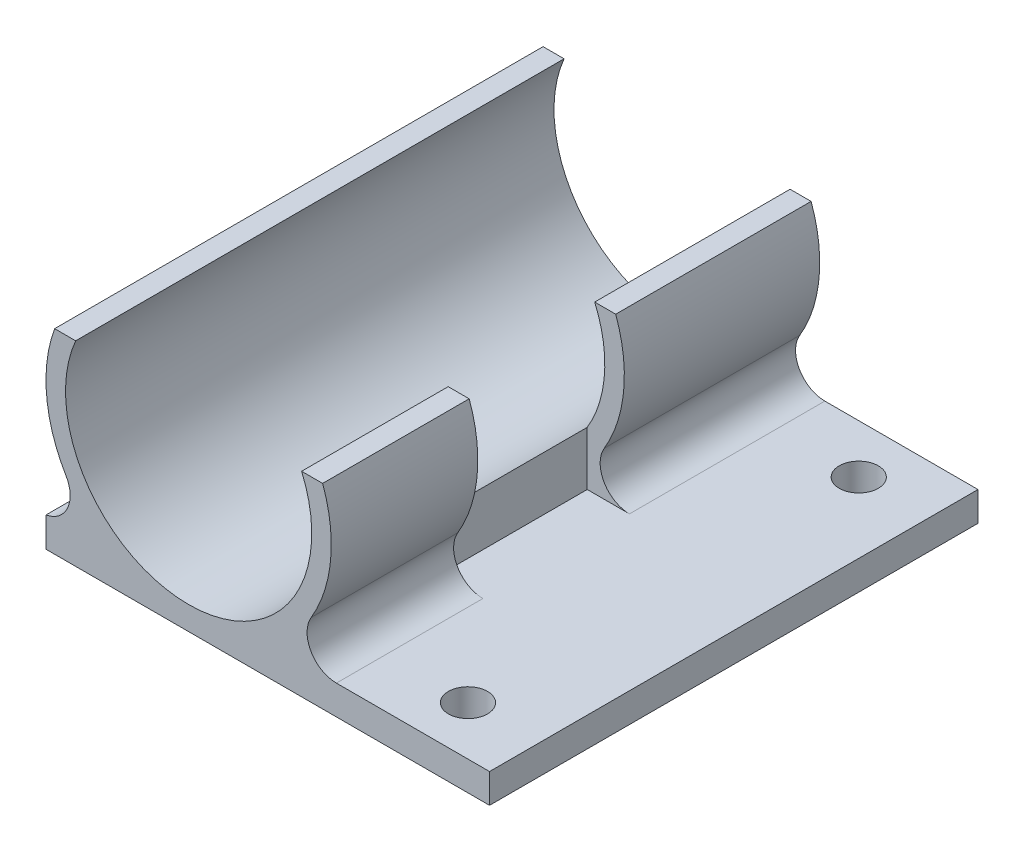
ISO-10303-21;
HEADER;
FILE_DESCRIPTION(('STEP AP214'),'2;1');
FILE_NAME('part.step','',(''),(''),'','','');
FILE_SCHEMA(('AUTOMOTIVE_DESIGN { 1 0 10303 214 1 1 1 1 }'));
ENDSEC;
DATA;
#1=APPLICATION_CONTEXT('core data for automotive mechanical design processes');
#2=APPLICATION_PROTOCOL_DEFINITION('international standard','automotive_design',2000,#1);
#3=PRODUCT_CONTEXT('',#1,'mechanical');
#4=PRODUCT('Part','Part','',(#3));
#5=PRODUCT_RELATED_PRODUCT_CATEGORY('part','',(#4));
#6=PRODUCT_DEFINITION_FORMATION('','',#4);
#7=PRODUCT_DEFINITION_CONTEXT('part definition',#1,'design');
#8=PRODUCT_DEFINITION('design','',#6,#7);
#9=PRODUCT_DEFINITION_SHAPE('','',#8);
#10=(LENGTH_UNIT() NAMED_UNIT(*) SI_UNIT(.MILLI.,.METRE.));
#11=(NAMED_UNIT(*) PLANE_ANGLE_UNIT() SI_UNIT($,.RADIAN.));
#12=(NAMED_UNIT(*) SI_UNIT($,.STERADIAN.) SOLID_ANGLE_UNIT());
#13=UNCERTAINTY_MEASURE_WITH_UNIT(LENGTH_MEASURE(1.E-05),#10,'distance_accuracy_value','');
#14=(GEOMETRIC_REPRESENTATION_CONTEXT(3) GLOBAL_UNCERTAINTY_ASSIGNED_CONTEXT((#13)) GLOBAL_UNIT_ASSIGNED_CONTEXT((#10,
#11,#12)) REPRESENTATION_CONTEXT('',''));
#15=CARTESIAN_POINT('',(0.,0.,0.));
#16=DIRECTION('',(0.,0.,1.));
#17=DIRECTION('',(1.,0.,0.));
#18=AXIS2_PLACEMENT_3D('',#15,#16,#17);
#19=CARTESIAN_POINT('',(37.6248140484437,-9.,50.));
#20=DIRECTION('',(0.,0.,-1.));
#21=DIRECTION('',(-1.,0.,0.));
#22=AXIS2_PLACEMENT_3D('',#19,#20,#21);
#23=CYLINDRICAL_SURFACE('',#22,3.);
#24=DIRECTION('',(0.,0.,-1.));
#25=VECTOR('',#24,1.);
#26=CARTESIAN_POINT('',(37.6248140484437,-12.,50.));
#27=LINE('',#26,#25);
#28=CARTESIAN_POINT('',(37.6248140484437,-12.,50.));
#29=VERTEX_POINT('',#28);
#30=CARTESIAN_POINT('',(37.6248140484437,-12.,35.));
#31=VERTEX_POINT('',#30);
#32=EDGE_CURVE('E208',#29,#31,#27,.T.);
#33=ORIENTED_EDGE('',*,*,#32,.T.);
#34=CARTESIAN_POINT('',(37.6248140484437,-9.,35.));
#35=DIRECTION('',(0.,0.,1.));
#36=DIRECTION('',(1.,0.,0.));
#37=AXIS2_PLACEMENT_3D('',#34,#35,#36);
#38=CIRCLE('',#37,3.);
#39=CARTESIAN_POINT('',(35.0467207447317,-7.46590909090909,35.));
#40=VERTEX_POINT('',#39);
#41=EDGE_CURVE('E163',#31,#40,#38,.F.);
#42=ORIENTED_EDGE('',*,*,#41,.T.);
#43=DIRECTION('',(0.,0.,-1.));
#44=VECTOR('',#43,1.);
#45=CARTESIAN_POINT('',(35.0467207447317,-7.46590909090909,50.));
#46=LINE('',#45,#44);
#47=CARTESIAN_POINT('',(35.0467207447317,-7.46590909090909,50.));
#48=VERTEX_POINT('',#47);
#49=EDGE_CURVE('E204',#48,#40,#46,.T.);
#50=ORIENTED_EDGE('',*,*,#49,.F.);
#51=CARTESIAN_POINT('',(37.6248140484437,-9.,50.));
#52=DIRECTION('',(0.,0.,-1.));
#53=DIRECTION('',(-1.,0.,0.));
#54=AXIS2_PLACEMENT_3D('',#51,#52,#53);
#55=CIRCLE('',#54,3.);
#56=EDGE_CURVE('E253',#29,#48,#55,.T.);
#57=ORIENTED_EDGE('',*,*,#56,.F.);
#58=EDGE_LOOP('',(#33,#42,#50,#57));
#59=FACE_BOUND('',#58,.T.);
#60=ADVANCED_FACE('F33',(#59),#23,.F.);
#61=CARTESIAN_POINT('',(22.5,0.,50.));
#62=DIRECTION('',(0.,0.,-1.));
#63=DIRECTION('',(-1.,0.,0.));
#64=AXIS2_PLACEMENT_3D('',#61,#62,#63);
#65=CYLINDRICAL_SURFACE('',#64,14.6);
#66=ORIENTED_EDGE('',*,*,#49,.T.);
#67=CARTESIAN_POINT('',(22.5,0.,35.));
#68=DIRECTION('',(0.,0.,1.));
#69=DIRECTION('',(1.,0.,0.));
#70=AXIS2_PLACEMENT_3D('',#67,#68,#69);
#71=CIRCLE('',#70,14.6);
#72=CARTESIAN_POINT('',(36.2171425595858,5.,35.));
#73=VERTEX_POINT('',#72);
#74=EDGE_CURVE('E259',#40,#73,#71,.T.);
#75=ORIENTED_EDGE('',*,*,#74,.T.);
#76=DIRECTION('',(0.,0.,-1.));
#77=VECTOR('',#76,1.);
#78=CARTESIAN_POINT('',(36.2171425595858,5.,50.));
#79=LINE('',#78,#77);
#80=CARTESIAN_POINT('',(36.2171425595858,5.,50.));
#81=VERTEX_POINT('',#80);
#82=EDGE_CURVE('E200',#81,#73,#79,.T.);
#83=ORIENTED_EDGE('',*,*,#82,.F.);
#84=CARTESIAN_POINT('',(22.5,0.,50.));
#85=DIRECTION('',(0.,0.,1.));
#86=DIRECTION('',(1.,0.,0.));
#87=AXIS2_PLACEMENT_3D('',#84,#85,#86);
#88=CIRCLE('',#87,14.6);
#89=EDGE_CURVE('E251',#48,#81,#88,.T.);
#90=ORIENTED_EDGE('',*,*,#89,.F.);
#91=EDGE_LOOP('',(#66,#75,#83,#90));
#92=FACE_BOUND('',#91,.T.);
#93=ADVANCED_FACE('F348',(#92),#65,.T.);
#94=CARTESIAN_POINT('',(34.0654658358408,5.,50.));
#95=DIRECTION('',(0.,-1.,0.));
#96=DIRECTION('',(0.,0.,-1.));
#97=AXIS2_PLACEMENT_3D('',#94,#95,#96);
#98=PLANE('',#97);
#99=ORIENTED_EDGE('',*,*,#82,.T.);
#100=DIRECTION('',(-1.,0.,0.));
#101=VECTOR('',#100,1.);
#102=CARTESIAN_POINT('',(34.0654658358408,5.,35.));
#103=LINE('',#102,#101);
#104=CARTESIAN_POINT('',(34.0654658358408,5.,35.));
#105=VERTEX_POINT('',#104);
#106=EDGE_CURVE('E262',#73,#105,#103,.T.);
#107=ORIENTED_EDGE('',*,*,#106,.T.);
#108=DIRECTION('',(0.,0.,-1.));
#109=VECTOR('',#108,1.);
#110=CARTESIAN_POINT('',(34.0654658358408,5.,50.));
#111=LINE('',#110,#109);
#112=CARTESIAN_POINT('',(34.0654658358408,5.,50.));
#113=VERTEX_POINT('',#112);
#114=EDGE_CURVE('E196',#113,#105,#111,.T.);
#115=ORIENTED_EDGE('',*,*,#114,.F.);
#116=DIRECTION('',(-1.,0.,0.));
#117=VECTOR('',#116,1.);
#118=CARTESIAN_POINT('',(34.0654658358408,5.,50.));
#119=LINE('',#118,#117);
#120=EDGE_CURVE('E247',#81,#113,#119,.T.);
#121=ORIENTED_EDGE('',*,*,#120,.F.);
#122=EDGE_LOOP('',(#99,#107,#115,#121));
#123=FACE_BOUND('',#122,.T.);
#124=ADVANCED_FACE('F373',(#123),#98,.F.);
#125=CARTESIAN_POINT('',(53.3011834123252,-12.,50.));
#126=DIRECTION('',(-1.,0.,0.));
#127=DIRECTION('',(0.,0.,1.));
#128=AXIS2_PLACEMENT_3D('',#125,#126,#127);
#129=PLANE('',#128);
#130=DIRECTION('',(0.,1.,0.));
#131=VECTOR('',#130,1.);
#132=CARTESIAN_POINT('',(53.3011834123252,-12.,0.));
#133=LINE('',#132,#131);
#134=CARTESIAN_POINT('',(53.3011834123252,-15.,0.));
#135=VERTEX_POINT('',#134);
#136=CARTESIAN_POINT('',(53.3011834123252,-12.,0.));
#137=VERTEX_POINT('',#136);
#138=EDGE_CURVE('E159',#135,#137,#133,.T.);
#139=ORIENTED_EDGE('',*,*,#138,.T.);
#140=DIRECTION('',(0.,0.,-1.));
#141=VECTOR('',#140,1.);
#142=CARTESIAN_POINT('',(53.3011834123252,-12.,50.));
#143=LINE('',#142,#141);
#144=CARTESIAN_POINT('',(53.3011834123252,-12.,50.));
#145=VERTEX_POINT('',#144);
#146=EDGE_CURVE('E211',#145,#137,#143,.T.);
#147=ORIENTED_EDGE('',*,*,#146,.F.);
#148=DIRECTION('',(0.,1.,0.));
#149=VECTOR('',#148,1.);
#150=CARTESIAN_POINT('',(53.3011834123252,-12.,50.));
#151=LINE('',#150,#149);
#152=CARTESIAN_POINT('',(53.3011834123252,-15.,50.));
#153=VERTEX_POINT('',#152);
#154=EDGE_CURVE('E185',#153,#145,#151,.T.);
#155=ORIENTED_EDGE('',*,*,#154,.F.);
#156=DIRECTION('',(0.,0.,-1.));
#157=VECTOR('',#156,1.);
#158=CARTESIAN_POINT('',(53.3011834123252,-15.,50.));
#159=LINE('',#158,#157);
#160=EDGE_CURVE('E155',#153,#135,#159,.T.);
#161=ORIENTED_EDGE('',*,*,#160,.T.);
#162=EDGE_LOOP('',(#139,#147,#155,#161));
#163=FACE_BOUND('',#162,.T.);
#164=ADVANCED_FACE('F35',(#163),#129,.F.);
#165=CARTESIAN_POINT('',(37.6248140484437,-12.,50.));
#166=DIRECTION('',(0.,-1.,0.));
#167=DIRECTION('',(1.,0.,0.));
#168=AXIS2_PLACEMENT_3D('',#165,#166,#167);
#169=PLANE('',#168);
#170=CARTESIAN_POINT('',(46.0948174679937,-12.,5.));
#171=DIRECTION('',(0.,1.,0.));
#172=DIRECTION('',(-1.,0.,0.));
#173=AXIS2_PLACEMENT_3D('',#170,#171,#172);
#174=CIRCLE('',#173,2.);
#175=CARTESIAN_POINT('',(44.0948174679937,-12.,5.));
#176=VERTEX_POINT('',#175);
#177=EDGE_CURVE('E291',#176,#176,#174,.T.);
#178=ORIENTED_EDGE('',*,*,#177,.F.);
#179=EDGE_LOOP('',(#178));
#180=FACE_BOUND('',#179,.T.);
#181=CARTESIAN_POINT('',(46.0948174679937,-12.,45.));
#182=DIRECTION('',(0.,1.,0.));
#183=DIRECTION('',(-1.,0.,0.));
#184=AXIS2_PLACEMENT_3D('',#181,#182,#183);
#185=CIRCLE('',#184,2.);
#186=CARTESIAN_POINT('',(44.0948174679937,-12.,45.));
#187=VERTEX_POINT('',#186);
#188=EDGE_CURVE('E285',#187,#187,#185,.T.);
#189=ORIENTED_EDGE('',*,*,#188,.F.);
#190=EDGE_LOOP('',(#189));
#191=FACE_BOUND('',#190,.T.);
#192=CARTESIAN_POINT('',(37.6248140484437,-12.,20.));
#193=VERTEX_POINT('',#192);
#194=CARTESIAN_POINT('',(37.6248140484437,-12.,0.));
#195=VERTEX_POINT('',#194);
#196=EDGE_CURVE('E207',#193,#195,#27,.T.);
#197=ORIENTED_EDGE('',*,*,#196,.F.);
#198=DIRECTION('',(1.,0.,0.));
#199=VECTOR('',#198,1.);
#200=CARTESIAN_POINT('',(33.3011834123252,-12.,20.));
#201=LINE('',#200,#199);
#202=CARTESIAN_POINT('',(33.3011834123252,-12.,20.));
#203=VERTEX_POINT('',#202);
#204=EDGE_CURVE('E272',#203,#193,#201,.T.);
#205=ORIENTED_EDGE('',*,*,#204,.F.);
#206=DIRECTION('',(0.,0.,-1.));
#207=VECTOR('',#206,1.);
#208=CARTESIAN_POINT('',(33.3011834123252,-12.,35.));
#209=LINE('',#208,#207);
#210=CARTESIAN_POINT('',(33.3011834123252,-12.,35.));
#211=VERTEX_POINT('',#210);
#212=EDGE_CURVE('E279',#211,#203,#209,.T.);
#213=ORIENTED_EDGE('',*,*,#212,.F.);
#214=DIRECTION('',(1.,0.,0.));
#215=VECTOR('',#214,1.);
#216=CARTESIAN_POINT('',(33.3011834123252,-12.,35.));
#217=LINE('',#216,#215);
#218=EDGE_CURVE('E273',#211,#31,#217,.T.);
#219=ORIENTED_EDGE('',*,*,#218,.T.);
#220=ORIENTED_EDGE('',*,*,#32,.F.);
#221=DIRECTION('',(-1.,0.,0.));
#222=VECTOR('',#221,1.);
#223=CARTESIAN_POINT('',(37.6248140484437,-12.,50.));
#224=LINE('',#223,#222);
#225=EDGE_CURVE('E107',#145,#29,#224,.T.);
#226=ORIENTED_EDGE('',*,*,#225,.F.);
#227=ORIENTED_EDGE('',*,*,#146,.T.);
#228=DIRECTION('',(-1.,0.,0.));
#229=VECTOR('',#228,1.);
#230=CARTESIAN_POINT('',(37.6248140484437,-12.,0.));
#231=LINE('',#230,#229);
#232=EDGE_CURVE('E162',#137,#195,#231,.T.);
#233=ORIENTED_EDGE('',*,*,#232,.T.);
#234=EDGE_LOOP('',(#197,#205,#213,#219,#220,#226,#227,#233));
#235=FACE_BOUND('',#234,.T.);
#236=ADVANCED_FACE('F307',(#180,#191,#235),#169,.F.);
#237=CARTESIAN_POINT('',(35.0467207447317,-7.46590909090909,20.));
#238=VERTEX_POINT('',#237);
#239=CARTESIAN_POINT('',(35.0467207447317,-7.46590909090909,0.));
#240=VERTEX_POINT('',#239);
#241=EDGE_CURVE('E203',#238,#240,#46,.T.);
#242=ORIENTED_EDGE('',*,*,#241,.F.);
#243=CARTESIAN_POINT('',(37.6248140484437,-9.,20.));
#244=DIRECTION('',(0.,0.,-1.));
#245=DIRECTION('',(-1.,0.,0.));
#246=AXIS2_PLACEMENT_3D('',#243,#244,#245);
#247=CIRCLE('',#246,3.);
#248=EDGE_CURVE('E265',#238,#193,#247,.F.);
#249=ORIENTED_EDGE('',*,*,#248,.T.);
#250=ORIENTED_EDGE('',*,*,#196,.T.);
#251=CARTESIAN_POINT('',(37.6248140484437,-9.,0.));
#252=DIRECTION('',(0.,0.,-1.));
#253=DIRECTION('',(-1.,0.,0.));
#254=AXIS2_PLACEMENT_3D('',#251,#252,#253);
#255=CIRCLE('',#254,3.);
#256=EDGE_CURVE('E166',#195,#240,#255,.T.);
#257=ORIENTED_EDGE('',*,*,#256,.T.);
#258=EDGE_LOOP('',(#242,#249,#250,#257));
#259=FACE_BOUND('',#258,.T.);
#260=ADVANCED_FACE('F310',(#259),#23,.F.);
#261=CARTESIAN_POINT('',(36.2171425595858,5.,20.));
#262=VERTEX_POINT('',#261);
#263=CARTESIAN_POINT('',(36.2171425595858,5.,0.));
#264=VERTEX_POINT('',#263);
#265=EDGE_CURVE('E199',#262,#264,#79,.T.);
#266=ORIENTED_EDGE('',*,*,#265,.F.);
#267=CARTESIAN_POINT('',(22.5,0.,20.));
#268=DIRECTION('',(0.,0.,-1.));
#269=DIRECTION('',(-1.,0.,0.));
#270=AXIS2_PLACEMENT_3D('',#267,#268,#269);
#271=CIRCLE('',#270,14.6);
#272=EDGE_CURVE('E268',#262,#238,#271,.T.);
#273=ORIENTED_EDGE('',*,*,#272,.T.);
#274=ORIENTED_EDGE('',*,*,#241,.T.);
#275=CARTESIAN_POINT('',(22.5,0.,0.));
#276=DIRECTION('',(0.,0.,1.));
#277=DIRECTION('',(1.,0.,0.));
#278=AXIS2_PLACEMENT_3D('',#275,#276,#277);
#279=CIRCLE('',#278,14.6);
#280=EDGE_CURVE('E169',#240,#264,#279,.T.);
#281=ORIENTED_EDGE('',*,*,#280,.T.);
#282=EDGE_LOOP('',(#266,#273,#274,#281));
#283=FACE_BOUND('',#282,.T.);
#284=ADVANCED_FACE('F329',(#283),#65,.T.);
#285=CARTESIAN_POINT('',(34.0654658358408,5.,20.));
#286=VERTEX_POINT('',#285);
#287=CARTESIAN_POINT('',(34.0654658358408,5.,0.));
#288=VERTEX_POINT('',#287);
#289=EDGE_CURVE('E195',#286,#288,#111,.T.);
#290=ORIENTED_EDGE('',*,*,#289,.F.);
#291=DIRECTION('',(1.,0.,0.));
#292=VECTOR('',#291,1.);
#293=CARTESIAN_POINT('',(34.0654658358408,5.,20.));
#294=LINE('',#293,#292);
#295=EDGE_CURVE('E228',#286,#262,#294,.T.);
#296=ORIENTED_EDGE('',*,*,#295,.T.);
#297=ORIENTED_EDGE('',*,*,#265,.T.);
#298=DIRECTION('',(-1.,0.,0.));
#299=VECTOR('',#298,1.);
#300=CARTESIAN_POINT('',(34.0654658358408,5.,0.));
#301=LINE('',#300,#299);
#302=EDGE_CURVE('E172',#264,#288,#301,.T.);
#303=ORIENTED_EDGE('',*,*,#302,.T.);
#304=EDGE_LOOP('',(#290,#296,#297,#303));
#305=FACE_BOUND('',#304,.T.);
#306=ADVANCED_FACE('F227',(#305),#98,.F.);
#307=CARTESIAN_POINT('',(22.5,0.,50.));
#308=DIRECTION('',(0.,0.,-1.));
#309=DIRECTION('',(-1.,0.,0.));
#310=AXIS2_PLACEMENT_3D('',#307,#308,#309);
#311=CYLINDRICAL_SURFACE('',#310,12.6);
#312=ORIENTED_EDGE('',*,*,#114,.T.);
#313=CARTESIAN_POINT('',(22.5,0.,35.));
#314=DIRECTION('',(0.,0.,1.));
#315=DIRECTION('',(1.,0.,0.));
#316=AXIS2_PLACEMENT_3D('',#313,#314,#315);
#317=CIRCLE('',#316,12.6);
#318=CARTESIAN_POINT('',(33.3011834123252,-6.48802257188666,35.));
#319=VERTEX_POINT('',#318);
#320=EDGE_CURVE('E11',#105,#319,#317,.F.);
#321=ORIENTED_EDGE('',*,*,#320,.T.);
#322=DIRECTION('',(0.,0.,-1.));
#323=VECTOR('',#322,1.);
#324=CARTESIAN_POINT('',(33.3011834123252,-6.48802257188666,50.));
#325=LINE('',#324,#323);
#326=CARTESIAN_POINT('',(33.3011834123252,-6.48802257188666,20.));
#327=VERTEX_POINT('',#326);
#328=EDGE_CURVE('E213',#319,#327,#325,.T.);
#329=ORIENTED_EDGE('',*,*,#328,.T.);
#330=CARTESIAN_POINT('',(22.5,0.,20.));
#331=DIRECTION('',(0.,0.,-1.));
#332=DIRECTION('',(-1.,0.,0.));
#333=AXIS2_PLACEMENT_3D('',#330,#331,#332);
#334=CIRCLE('',#333,12.6);
#335=EDGE_CURVE('E41',#327,#286,#334,.F.);
#336=ORIENTED_EDGE('',*,*,#335,.T.);
#337=ORIENTED_EDGE('',*,*,#289,.T.);
#338=CARTESIAN_POINT('',(22.5,0.,0.));
#339=DIRECTION('',(0.,0.,-1.));
#340=DIRECTION('',(1.,0.,0.));
#341=AXIS2_PLACEMENT_3D('',#338,#339,#340);
#342=CIRCLE('',#341,12.6);
#343=CARTESIAN_POINT('',(10.9345341641592,5.,0.));
#344=VERTEX_POINT('',#343);
#345=EDGE_CURVE('E175',#288,#344,#342,.T.);
#346=ORIENTED_EDGE('',*,*,#345,.T.);
#347=DIRECTION('',(0.,0.,-1.));
#348=VECTOR('',#347,1.);
#349=CARTESIAN_POINT('',(10.9345341641592,5.,50.));
#350=LINE('',#349,#348);
#351=CARTESIAN_POINT('',(10.9345341641592,5.,50.));
#352=VERTEX_POINT('',#351);
#353=EDGE_CURVE('E192',#352,#344,#350,.T.);
#354=ORIENTED_EDGE('',*,*,#353,.F.);
#355=CARTESIAN_POINT('',(22.5,0.,50.));
#356=DIRECTION('',(0.,0.,-1.));
#357=DIRECTION('',(1.,0.,0.));
#358=AXIS2_PLACEMENT_3D('',#355,#356,#357);
#359=CIRCLE('',#358,12.6);
#360=EDGE_CURVE('E245',#113,#352,#359,.T.);
#361=ORIENTED_EDGE('',*,*,#360,.F.);
#362=EDGE_LOOP('',(#312,#321,#329,#336,#337,#346,#354,#361));
#363=FACE_BOUND('',#362,.T.);
#364=ADVANCED_FACE('F219',(#363),#311,.F.);
#365=CARTESIAN_POINT('',(8.7828574404142,5.,50.));
#366=DIRECTION('',(0.,-1.,0.));
#367=DIRECTION('',(1.,0.,0.));
#368=AXIS2_PLACEMENT_3D('',#365,#366,#367);
#369=PLANE('',#368);
#370=DIRECTION('',(-1.,0.,0.));
#371=VECTOR('',#370,1.);
#372=CARTESIAN_POINT('',(8.7828574404142,5.,0.));
#373=LINE('',#372,#371);
#374=CARTESIAN_POINT('',(8.7828574404142,5.,0.));
#375=VERTEX_POINT('',#374);
#376=EDGE_CURVE('E177',#344,#375,#373,.T.);
#377=ORIENTED_EDGE('',*,*,#376,.T.);
#378=DIRECTION('',(0.,0.,-1.));
#379=VECTOR('',#378,1.);
#380=CARTESIAN_POINT('',(8.7828574404142,5.,50.));
#381=LINE('',#380,#379);
#382=CARTESIAN_POINT('',(8.7828574404142,5.,50.));
#383=VERTEX_POINT('',#382);
#384=EDGE_CURVE('E189',#383,#375,#381,.T.);
#385=ORIENTED_EDGE('',*,*,#384,.F.);
#386=DIRECTION('',(-1.,0.,0.));
#387=VECTOR('',#386,1.);
#388=CARTESIAN_POINT('',(8.7828574404142,5.,50.));
#389=LINE('',#388,#387);
#390=EDGE_CURVE('E244',#352,#383,#389,.T.);
#391=ORIENTED_EDGE('',*,*,#390,.F.);
#392=ORIENTED_EDGE('',*,*,#353,.T.);
#393=EDGE_LOOP('',(#377,#385,#391,#392));
#394=FACE_BOUND('',#393,.T.);
#395=ADVANCED_FACE('F242',(#394),#369,.F.);
#396=CARTESIAN_POINT('',(22.5,0.,50.));
#397=DIRECTION('',(0.,0.,-1.));
#398=DIRECTION('',(-1.,0.,0.));
#399=AXIS2_PLACEMENT_3D('',#396,#397,#398);
#400=CYLINDRICAL_SURFACE('',#399,14.6);
#401=CARTESIAN_POINT('',(22.5,0.,0.));
#402=DIRECTION('',(0.,0.,1.));
#403=DIRECTION('',(1.,0.,0.));
#404=AXIS2_PLACEMENT_3D('',#401,#402,#403);
#405=CIRCLE('',#404,14.6);
#406=CARTESIAN_POINT('',(9.95327925526828,-7.46590909090909,0.));
#407=VERTEX_POINT('',#406);
#408=EDGE_CURVE('E179',#375,#407,#405,.T.);
#409=ORIENTED_EDGE('',*,*,#408,.T.);
#410=DIRECTION('',(0.,0.,-1.));
#411=VECTOR('',#410,1.);
#412=CARTESIAN_POINT('',(9.95327925526828,-7.46590909090909,50.));
#413=LINE('',#412,#411);
#414=CARTESIAN_POINT('',(9.95327925526828,-7.46590909090909,50.));
#415=VERTEX_POINT('',#414);
#416=EDGE_CURVE('E150',#415,#407,#413,.T.);
#417=ORIENTED_EDGE('',*,*,#416,.F.);
#418=CARTESIAN_POINT('',(22.5,0.,50.));
#419=DIRECTION('',(0.,0.,1.));
#420=DIRECTION('',(1.,0.,0.));
#421=AXIS2_PLACEMENT_3D('',#418,#419,#420);
#422=CIRCLE('',#421,14.6);
#423=EDGE_CURVE('E138',#383,#415,#422,.T.);
#424=ORIENTED_EDGE('',*,*,#423,.F.);
#425=ORIENTED_EDGE('',*,*,#384,.T.);
#426=EDGE_LOOP('',(#409,#417,#424,#425));
#427=FACE_BOUND('',#426,.T.);
#428=ADVANCED_FACE('F388',(#427),#400,.T.);
#429=CARTESIAN_POINT('',(7.37518595155629,-9.,50.));
#430=DIRECTION('',(0.,0.,-1.));
#431=DIRECTION('',(-1.,0.,0.));
#432=AXIS2_PLACEMENT_3D('',#429,#430,#431);
#433=CYLINDRICAL_SURFACE('',#432,3.);
#434=CARTESIAN_POINT('',(7.37518595155629,-9.,0.));
#435=DIRECTION('',(0.,0.,-1.));
#436=DIRECTION('',(1.,0.,0.));
#437=AXIS2_PLACEMENT_3D('',#434,#435,#436);
#438=CIRCLE('',#437,3.);
#439=CARTESIAN_POINT('',(7.89999999999999,-11.9537383456488,0.));
#440=VERTEX_POINT('',#439);
#441=EDGE_CURVE('E147',#407,#440,#438,.T.);
#442=ORIENTED_EDGE('',*,*,#441,.T.);
#443=DIRECTION('',(0.,0.,-1.));
#444=VECTOR('',#443,1.);
#445=CARTESIAN_POINT('',(7.89999999999999,-11.9537383456488,50.));
#446=LINE('',#445,#444);
#447=CARTESIAN_POINT('',(7.89999999999999,-11.9537383456488,50.));
#448=VERTEX_POINT('',#447);
#449=EDGE_CURVE('E144',#448,#440,#446,.T.);
#450=ORIENTED_EDGE('',*,*,#449,.F.);
#451=CARTESIAN_POINT('',(7.37518595155629,-9.,50.));
#452=DIRECTION('',(0.,0.,-1.));
#453=DIRECTION('',(1.,0.,0.));
#454=AXIS2_PLACEMENT_3D('',#451,#452,#453);
#455=CIRCLE('',#454,3.);
#456=EDGE_CURVE('E131',#415,#448,#455,.T.);
#457=ORIENTED_EDGE('',*,*,#456,.F.);
#458=ORIENTED_EDGE('',*,*,#416,.T.);
#459=EDGE_LOOP('',(#442,#450,#457,#458));
#460=FACE_BOUND('',#459,.T.);
#461=ADVANCED_FACE('F145',(#460),#433,.F.);
#462=CARTESIAN_POINT('',(7.89999999999999,-11.9537383456488,50.));
#463=DIRECTION('',(1.,0.,0.));
#464=DIRECTION('',(0.,1.,0.));
#465=AXIS2_PLACEMENT_3D('',#462,#463,#464);
#466=PLANE('',#465);
#467=DIRECTION('',(0.,-1.,0.));
#468=VECTOR('',#467,1.);
#469=CARTESIAN_POINT('',(7.89999999999999,-11.9537383456488,0.));
#470=LINE('',#469,#468);
#471=CARTESIAN_POINT('',(7.89999999999999,-15.,0.));
#472=VERTEX_POINT('',#471);
#473=EDGE_CURVE('E182',#440,#472,#470,.T.);
#474=ORIENTED_EDGE('',*,*,#473,.T.);
#475=DIRECTION('',(0.,0.,-1.));
#476=VECTOR('',#475,1.);
#477=CARTESIAN_POINT('',(7.89999999999999,-15.,50.));
#478=LINE('',#477,#476);
#479=CARTESIAN_POINT('',(7.89999999999999,-15.,50.));
#480=VERTEX_POINT('',#479);
#481=EDGE_CURVE('E151',#480,#472,#478,.T.);
#482=ORIENTED_EDGE('',*,*,#481,.F.);
#483=DIRECTION('',(0.,-1.,0.));
#484=VECTOR('',#483,1.);
#485=CARTESIAN_POINT('',(7.89999999999999,-11.9537383456488,50.));
#486=LINE('',#485,#484);
#487=EDGE_CURVE('E135',#448,#480,#486,.T.);
#488=ORIENTED_EDGE('',*,*,#487,.F.);
#489=ORIENTED_EDGE('',*,*,#449,.T.);
#490=EDGE_LOOP('',(#474,#482,#488,#489));
#491=FACE_BOUND('',#490,.T.);
#492=ADVANCED_FACE('F153',(#491),#466,.F.);
#493=CARTESIAN_POINT('',(7.89999999999999,-15.,50.));
#494=DIRECTION('',(0.,1.,0.));
#495=DIRECTION('',(0.,0.,1.));
#496=AXIS2_PLACEMENT_3D('',#493,#494,#495);
#497=PLANE('',#496);
#498=CARTESIAN_POINT('',(46.0948174679937,-15.,5.));
#499=DIRECTION('',(0.,1.,0.));
#500=DIRECTION('',(-1.,0.,0.));
#501=AXIS2_PLACEMENT_3D('',#498,#499,#500);
#502=CIRCLE('',#501,2.);
#503=CARTESIAN_POINT('',(44.0948174679937,-15.,5.));
#504=VERTEX_POINT('',#503);
#505=EDGE_CURVE('E288',#504,#504,#502,.T.);
#506=ORIENTED_EDGE('',*,*,#505,.T.);
#507=EDGE_LOOP('',(#506));
#508=FACE_BOUND('',#507,.T.);
#509=CARTESIAN_POINT('',(46.0948174679937,-15.,45.));
#510=DIRECTION('',(0.,1.,0.));
#511=DIRECTION('',(-1.,0.,0.));
#512=AXIS2_PLACEMENT_3D('',#509,#510,#511);
#513=CIRCLE('',#512,2.);
#514=CARTESIAN_POINT('',(44.0948174679937,-15.,45.));
#515=VERTEX_POINT('',#514);
#516=EDGE_CURVE('E284',#515,#515,#513,.T.);
#517=ORIENTED_EDGE('',*,*,#516,.T.);
#518=EDGE_LOOP('',(#517));
#519=FACE_BOUND('',#518,.T.);
#520=DIRECTION('',(1.,0.,0.));
#521=VECTOR('',#520,1.);
#522=CARTESIAN_POINT('',(7.89999999999999,-15.,0.));
#523=LINE('',#522,#521);
#524=EDGE_CURVE('E99',#472,#135,#523,.T.);
#525=ORIENTED_EDGE('',*,*,#524,.T.);
#526=ORIENTED_EDGE('',*,*,#160,.F.);
#527=DIRECTION('',(1.,0.,0.));
#528=VECTOR('',#527,1.);
#529=CARTESIAN_POINT('',(7.89999999999999,-15.,50.));
#530=LINE('',#529,#528);
#531=EDGE_CURVE('E57',#480,#153,#530,.T.);
#532=ORIENTED_EDGE('',*,*,#531,.F.);
#533=ORIENTED_EDGE('',*,*,#481,.T.);
#534=EDGE_LOOP('',(#525,#526,#532,#533));
#535=FACE_BOUND('',#534,.T.);
#536=ADVANCED_FACE('F297',(#508,#519,#535),#497,.F.);
#537=CARTESIAN_POINT('',(7.37518595155629,-9.,50.));
#538=DIRECTION('',(0.,0.,1.));
#539=DIRECTION('',(1.,0.,0.));
#540=AXIS2_PLACEMENT_3D('',#537,#538,#539);
#541=PLANE('',#540);
#542=ORIENTED_EDGE('',*,*,#154,.T.);
#543=ORIENTED_EDGE('',*,*,#225,.T.);
#544=ORIENTED_EDGE('',*,*,#56,.T.);
#545=ORIENTED_EDGE('',*,*,#89,.T.);
#546=ORIENTED_EDGE('',*,*,#120,.T.);
#547=ORIENTED_EDGE('',*,*,#360,.T.);
#548=ORIENTED_EDGE('',*,*,#390,.T.);
#549=ORIENTED_EDGE('',*,*,#423,.T.);
#550=ORIENTED_EDGE('',*,*,#456,.T.);
#551=ORIENTED_EDGE('',*,*,#487,.T.);
#552=ORIENTED_EDGE('',*,*,#531,.T.);
#553=EDGE_LOOP('',(#542,#543,#544,#545,#546,#547,#548,#549,#550,#551,#552));
#554=FACE_BOUND('',#553,.T.);
#555=ADVANCED_FACE('F133',(#554),#541,.T.);
#556=CARTESIAN_POINT('',(7.37518595155629,-9.,0.));
#557=DIRECTION('',(0.,0.,1.));
#558=DIRECTION('',(1.,0.,0.));
#559=AXIS2_PLACEMENT_3D('',#556,#557,#558);
#560=PLANE('',#559);
#561=ORIENTED_EDGE('',*,*,#138,.F.);
#562=ORIENTED_EDGE('',*,*,#524,.F.);
#563=ORIENTED_EDGE('',*,*,#473,.F.);
#564=ORIENTED_EDGE('',*,*,#441,.F.);
#565=ORIENTED_EDGE('',*,*,#408,.F.);
#566=ORIENTED_EDGE('',*,*,#376,.F.);
#567=ORIENTED_EDGE('',*,*,#345,.F.);
#568=ORIENTED_EDGE('',*,*,#302,.F.);
#569=ORIENTED_EDGE('',*,*,#280,.F.);
#570=ORIENTED_EDGE('',*,*,#256,.F.);
#571=ORIENTED_EDGE('',*,*,#232,.F.);
#572=EDGE_LOOP('',(#561,#562,#563,#564,#565,#566,#567,#568,#569,#570,#571));
#573=FACE_BOUND('',#572,.T.);
#574=ADVANCED_FACE('F236',(#573),#560,.F.);
#575=CARTESIAN_POINT('',(33.3011834123252,-12.,35.));
#576=DIRECTION('',(0.,0.,1.));
#577=DIRECTION('',(1.,0.,0.));
#578=AXIS2_PLACEMENT_3D('',#575,#576,#577);
#579=PLANE('',#578);
#580=ORIENTED_EDGE('',*,*,#218,.F.);
#581=DIRECTION('',(0.,-1.,0.));
#582=VECTOR('',#581,1.);
#583=CARTESIAN_POINT('',(33.3011834123252,-12.,35.));
#584=LINE('',#583,#582);
#585=EDGE_CURVE('E281',#319,#211,#584,.T.);
#586=ORIENTED_EDGE('',*,*,#585,.F.);
#587=ORIENTED_EDGE('',*,*,#320,.F.);
#588=ORIENTED_EDGE('',*,*,#106,.F.);
#589=ORIENTED_EDGE('',*,*,#74,.F.);
#590=ORIENTED_EDGE('',*,*,#41,.F.);
#591=EDGE_LOOP('',(#580,#586,#587,#588,#589,#590));
#592=FACE_BOUND('',#591,.T.);
#593=ADVANCED_FACE('F341',(#592),#579,.F.);
#594=CARTESIAN_POINT('',(33.3011834123252,-12.,20.));
#595=DIRECTION('',(0.,0.,-1.));
#596=DIRECTION('',(-1.,0.,0.));
#597=AXIS2_PLACEMENT_3D('',#594,#595,#596);
#598=PLANE('',#597);
#599=ORIENTED_EDGE('',*,*,#272,.F.);
#600=ORIENTED_EDGE('',*,*,#295,.F.);
#601=ORIENTED_EDGE('',*,*,#335,.F.);
#602=DIRECTION('',(0.,1.,0.));
#603=VECTOR('',#602,1.);
#604=CARTESIAN_POINT('',(33.3011834123252,-12.,20.));
#605=LINE('',#604,#603);
#606=EDGE_CURVE('E48',#203,#327,#605,.T.);
#607=ORIENTED_EDGE('',*,*,#606,.F.);
#608=ORIENTED_EDGE('',*,*,#204,.T.);
#609=ORIENTED_EDGE('',*,*,#248,.F.);
#610=EDGE_LOOP('',(#599,#600,#601,#607,#608,#609));
#611=FACE_BOUND('',#610,.T.);
#612=ADVANCED_FACE('F325',(#611),#598,.F.);
#613=CARTESIAN_POINT('',(33.3011834123252,0.,0.));
#614=DIRECTION('',(-1.,0.,0.));
#615=DIRECTION('',(0.,0.,1.));
#616=AXIS2_PLACEMENT_3D('',#613,#614,#615);
#617=PLANE('',#616);
#618=ORIENTED_EDGE('',*,*,#585,.T.);
#619=ORIENTED_EDGE('',*,*,#212,.T.);
#620=ORIENTED_EDGE('',*,*,#606,.T.);
#621=ORIENTED_EDGE('',*,*,#328,.F.);
#622=EDGE_LOOP('',(#618,#619,#620,#621));
#623=FACE_BOUND('',#622,.T.);
#624=ADVANCED_FACE('F358',(#623),#617,.F.);
#625=CARTESIAN_POINT('',(46.0948174679937,-15.,45.));
#626=DIRECTION('',(0.,1.,0.));
#627=DIRECTION('',(-1.,0.,0.));
#628=AXIS2_PLACEMENT_3D('',#625,#626,#627);
#629=CYLINDRICAL_SURFACE('',#628,2.);
#630=ORIENTED_EDGE('',*,*,#516,.F.);
#631=EDGE_LOOP('',(#630));
#632=FACE_BOUND('',#631,.T.);
#633=ORIENTED_EDGE('',*,*,#188,.T.);
#634=EDGE_LOOP('',(#633));
#635=FACE_BOUND('',#634,.T.);
#636=ADVANCED_FACE('F303',(#632,#635),#629,.F.);
#637=CARTESIAN_POINT('',(46.0948174679937,-15.,5.));
#638=DIRECTION('',(0.,1.,0.));
#639=DIRECTION('',(-1.,0.,0.));
#640=AXIS2_PLACEMENT_3D('',#637,#638,#639);
#641=CYLINDRICAL_SURFACE('',#640,2.);
#642=ORIENTED_EDGE('',*,*,#505,.F.);
#643=EDGE_LOOP('',(#642));
#644=FACE_BOUND('',#643,.T.);
#645=ORIENTED_EDGE('',*,*,#177,.T.);
#646=EDGE_LOOP('',(#645));
#647=FACE_BOUND('',#646,.T.);
#648=ADVANCED_FACE('F300',(#644,#647),#641,.F.);
#649=CLOSED_SHELL('',(#60,#93,#124,#164,#236,#260,#284,#306,#364,#395,#428,#461,#492,#536,#555,
#574,#593,#612,#624,#636,#648));
#650=MANIFOLD_SOLID_BREP('B2',#649);
#651=ADVANCED_BREP_SHAPE_REPRESENTATION('',(#18,#650),#14);
#652=SHAPE_DEFINITION_REPRESENTATION(#9,#651);
ENDSEC;
END-ISO-10303-21;
